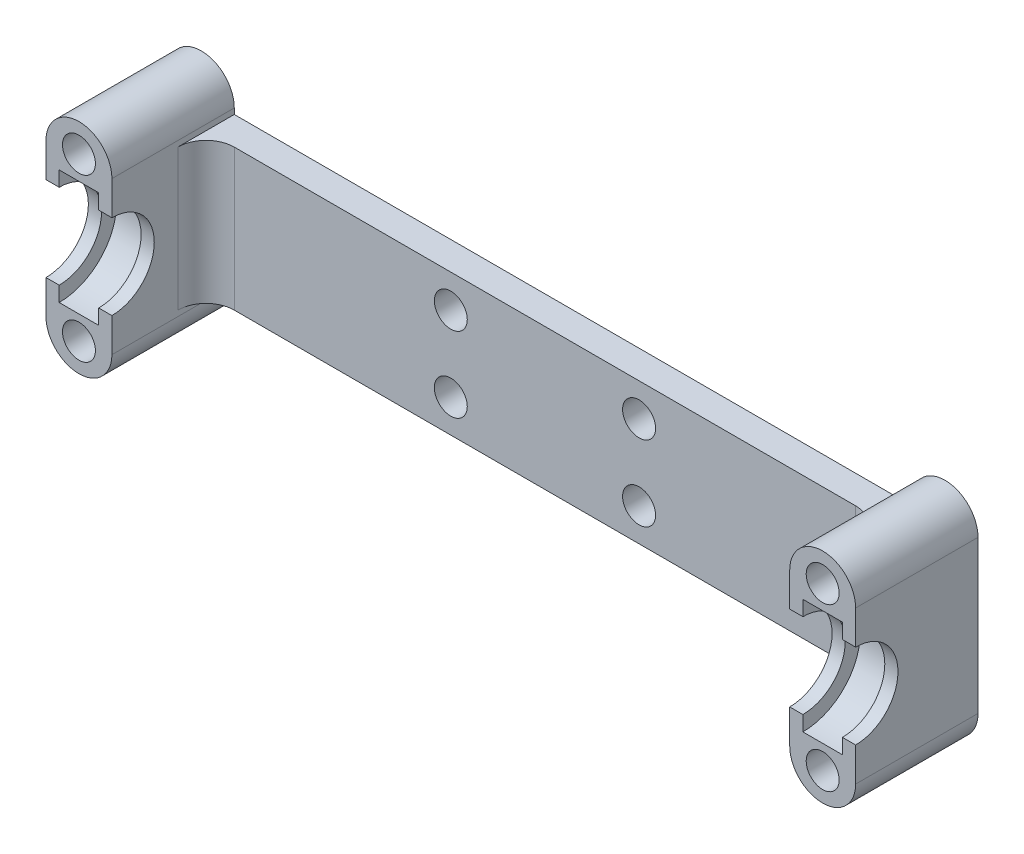
ISO-10303-21;
HEADER;
FILE_DESCRIPTION(('STEP AP214'),'2;1');
FILE_NAME('part.step','',(''),(''),'','','');
FILE_SCHEMA(('AUTOMOTIVE_DESIGN { 1 0 10303 214 1 1 1 1 }'));
ENDSEC;
DATA;
#1=APPLICATION_CONTEXT('core data for automotive mechanical design processes');
#2=APPLICATION_PROTOCOL_DEFINITION('international standard','automotive_design',2000,#1);
#3=PRODUCT_CONTEXT('',#1,'mechanical');
#4=PRODUCT('Part','Part','',(#3));
#5=PRODUCT_RELATED_PRODUCT_CATEGORY('part','',(#4));
#6=PRODUCT_DEFINITION_FORMATION('','',#4);
#7=PRODUCT_DEFINITION_CONTEXT('part definition',#1,'design');
#8=PRODUCT_DEFINITION('design','',#6,#7);
#9=PRODUCT_DEFINITION_SHAPE('','',#8);
#10=(LENGTH_UNIT() NAMED_UNIT(*) SI_UNIT(.MILLI.,.METRE.));
#11=(NAMED_UNIT(*) PLANE_ANGLE_UNIT() SI_UNIT($,.RADIAN.));
#12=(NAMED_UNIT(*) SI_UNIT($,.STERADIAN.) SOLID_ANGLE_UNIT());
#13=UNCERTAINTY_MEASURE_WITH_UNIT(LENGTH_MEASURE(1.E-05),#10,'distance_accuracy_value','');
#14=(GEOMETRIC_REPRESENTATION_CONTEXT(3) GLOBAL_UNCERTAINTY_ASSIGNED_CONTEXT((#13)) GLOBAL_UNIT_ASSIGNED_CONTEXT((#10,
#11,#12)) REPRESENTATION_CONTEXT('',''));
#15=CARTESIAN_POINT('',(0.,0.,0.));
#16=DIRECTION('',(0.,0.,1.));
#17=DIRECTION('',(1.,0.,0.));
#18=AXIS2_PLACEMENT_3D('',#15,#16,#17);
#19=CARTESIAN_POINT('',(-43.,-7.5,3.));
#20=DIRECTION('',(0.,1.,0.));
#21=DIRECTION('',(0.,0.,1.));
#22=AXIS2_PLACEMENT_3D('',#19,#20,#21);
#23=PLANE('',#22);
#24=DIRECTION('',(0.,0.,1.));
#25=VECTOR('',#24,1.);
#26=CARTESIAN_POINT('',(-36.,-7.5,3.));
#27=LINE('',#26,#25);
#28=CARTESIAN_POINT('',(-36.,-7.5,0.));
#29=VERTEX_POINT('',#28);
#30=CARTESIAN_POINT('',(-36.,-7.5,6.));
#31=VERTEX_POINT('',#30);
#32=EDGE_CURVE('E69',#29,#31,#27,.T.);
#33=ORIENTED_EDGE('',*,*,#32,.F.);
#34=DIRECTION('',(1.,0.,0.));
#35=VECTOR('',#34,1.);
#36=CARTESIAN_POINT('',(-43.,-7.5,0.));
#37=LINE('',#36,#35);
#38=CARTESIAN_POINT('',(36.,-7.5,0.));
#39=VERTEX_POINT('',#38);
#40=EDGE_CURVE('E437',#29,#39,#37,.T.);
#41=ORIENTED_EDGE('',*,*,#40,.T.);
#42=DIRECTION('',(0.,0.,1.));
#43=VECTOR('',#42,1.);
#44=CARTESIAN_POINT('',(36.,-7.5,3.));
#45=LINE('',#44,#43);
#46=CARTESIAN_POINT('',(36.,-7.5,6.));
#47=VERTEX_POINT('',#46);
#48=EDGE_CURVE('E305',#39,#47,#45,.T.);
#49=ORIENTED_EDGE('',*,*,#48,.T.);
#50=CARTESIAN_POINT('',(33.,-7.5,6.));
#51=DIRECTION('',(0.,1.,0.));
#52=DIRECTION('',(0.,0.,1.));
#53=AXIS2_PLACEMENT_3D('',#50,#51,#52);
#54=CIRCLE('',#53,3.);
#55=CARTESIAN_POINT('',(33.,-7.5,3.));
#56=VERTEX_POINT('',#55);
#57=EDGE_CURVE('E502',#47,#56,#54,.T.);
#58=ORIENTED_EDGE('',*,*,#57,.T.);
#59=DIRECTION('',(1.,0.,0.));
#60=VECTOR('',#59,1.);
#61=CARTESIAN_POINT('',(-43.,-7.5,3.));
#62=LINE('',#61,#60);
#63=CARTESIAN_POINT('',(-33.,-7.5,3.));
#64=VERTEX_POINT('',#63);
#65=EDGE_CURVE('E436',#64,#56,#62,.T.);
#66=ORIENTED_EDGE('',*,*,#65,.F.);
#67=CARTESIAN_POINT('',(-33.,-7.5,6.));
#68=DIRECTION('',(0.,1.,0.));
#69=DIRECTION('',(0.,0.,1.));
#70=AXIS2_PLACEMENT_3D('',#67,#68,#69);
#71=CIRCLE('',#70,3.);
#72=EDGE_CURVE('E11',#64,#31,#71,.T.);
#73=ORIENTED_EDGE('',*,*,#72,.T.);
#74=EDGE_LOOP('',(#33,#41,#49,#58,#66,#73));
#75=FACE_BOUND('',#74,.T.);
#76=ADVANCED_FACE('F45',(#75),#23,.F.);
#77=CARTESIAN_POINT('',(-43.,0.,13.));
#78=DIRECTION('',(1.,0.,0.));
#79=DIRECTION('',(0.,0.,-1.));
#80=AXIS2_PLACEMENT_3D('',#77,#78,#79);
#81=CYLINDRICAL_SURFACE('',#80,4.5);
#82=CARTESIAN_POINT('',(-37.4,0.,13.));
#83=DIRECTION('',(-1.,0.,0.));
#84=DIRECTION('',(0.,0.,1.));
#85=AXIS2_PLACEMENT_3D('',#82,#83,#84);
#86=CIRCLE('',#85,4.5);
#87=CARTESIAN_POINT('',(-37.4,-4.5,13.));
#88=VERTEX_POINT('',#87);
#89=CARTESIAN_POINT('',(-37.4,4.5,13.));
#90=VERTEX_POINT('',#89);
#91=EDGE_CURVE('E470',#88,#90,#86,.F.);
#92=ORIENTED_EDGE('',*,*,#91,.F.);
#93=DIRECTION('',(1.,0.,0.));
#94=VECTOR('',#93,1.);
#95=CARTESIAN_POINT('',(-43.,-4.5,13.));
#96=LINE('',#95,#94);
#97=CARTESIAN_POINT('',(-36.,-4.5,13.));
#98=VERTEX_POINT('',#97);
#99=EDGE_CURVE('E413',#88,#98,#96,.T.);
#100=ORIENTED_EDGE('',*,*,#99,.T.);
#101=CARTESIAN_POINT('',(-36.,0.,13.));
#102=DIRECTION('',(-1.,0.,0.));
#103=DIRECTION('',(0.,0.,1.));
#104=AXIS2_PLACEMENT_3D('',#101,#102,#103);
#105=CIRCLE('',#104,4.5);
#106=CARTESIAN_POINT('',(-36.,4.5,13.));
#107=VERTEX_POINT('',#106);
#108=EDGE_CURVE('E409',#107,#98,#105,.T.);
#109=ORIENTED_EDGE('',*,*,#108,.F.);
#110=DIRECTION('',(1.,0.,0.));
#111=VECTOR('',#110,1.);
#112=CARTESIAN_POINT('',(-43.,4.5,13.));
#113=LINE('',#112,#111);
#114=EDGE_CURVE('E405',#107,#90,#113,.F.);
#115=ORIENTED_EDGE('',*,*,#114,.T.);
#116=EDGE_LOOP('',(#92,#100,#109,#115));
#117=FACE_BOUND('',#116,.T.);
#118=ADVANCED_FACE('F568',(#117),#81,.F.);
#119=CARTESIAN_POINT('',(-43.,7.5,3.));
#120=DIRECTION('',(0.,-1.,0.));
#121=DIRECTION('',(0.,0.,-1.));
#122=AXIS2_PLACEMENT_3D('',#119,#120,#121);
#123=PLANE('',#122);
#124=DIRECTION('',(-1.,0.,0.));
#125=VECTOR('',#124,1.);
#126=CARTESIAN_POINT('',(-43.,7.5,0.));
#127=LINE('',#126,#125);
#128=CARTESIAN_POINT('',(36.,7.5,0.));
#129=VERTEX_POINT('',#128);
#130=CARTESIAN_POINT('',(-36.,7.5,0.));
#131=VERTEX_POINT('',#130);
#132=EDGE_CURVE('E444',#129,#131,#127,.T.);
#133=ORIENTED_EDGE('',*,*,#132,.T.);
#134=DIRECTION('',(0.,0.,1.));
#135=VECTOR('',#134,1.);
#136=CARTESIAN_POINT('',(-36.,7.5,3.));
#137=LINE('',#136,#135);
#138=CARTESIAN_POINT('',(-36.,7.5,6.));
#139=VERTEX_POINT('',#138);
#140=EDGE_CURVE('E61',#131,#139,#137,.T.);
#141=ORIENTED_EDGE('',*,*,#140,.T.);
#142=CARTESIAN_POINT('',(-33.,7.5,6.));
#143=DIRECTION('',(0.,-1.,0.));
#144=DIRECTION('',(0.,0.,-1.));
#145=AXIS2_PLACEMENT_3D('',#142,#143,#144);
#146=CIRCLE('',#145,3.);
#147=CARTESIAN_POINT('',(-33.,7.5,3.));
#148=VERTEX_POINT('',#147);
#149=EDGE_CURVE('E54',#139,#148,#146,.T.);
#150=ORIENTED_EDGE('',*,*,#149,.T.);
#151=DIRECTION('',(-1.,0.,0.));
#152=VECTOR('',#151,1.);
#153=CARTESIAN_POINT('',(-43.,7.5,3.));
#154=LINE('',#153,#152);
#155=CARTESIAN_POINT('',(33.,7.5,3.));
#156=VERTEX_POINT('',#155);
#157=EDGE_CURVE('E432',#156,#148,#154,.T.);
#158=ORIENTED_EDGE('',*,*,#157,.F.);
#159=CARTESIAN_POINT('',(33.,7.5,6.));
#160=DIRECTION('',(0.,-1.,0.));
#161=DIRECTION('',(0.,0.,-1.));
#162=AXIS2_PLACEMENT_3D('',#159,#160,#161);
#163=CIRCLE('',#162,3.);
#164=CARTESIAN_POINT('',(36.,7.5,6.));
#165=VERTEX_POINT('',#164);
#166=EDGE_CURVE('E505',#156,#165,#163,.T.);
#167=ORIENTED_EDGE('',*,*,#166,.T.);
#168=DIRECTION('',(0.,0.,1.));
#169=VECTOR('',#168,1.);
#170=CARTESIAN_POINT('',(36.,7.5,3.));
#171=LINE('',#170,#169);
#172=EDGE_CURVE('E366',#129,#165,#171,.T.);
#173=ORIENTED_EDGE('',*,*,#172,.F.);
#174=EDGE_LOOP('',(#133,#141,#150,#158,#167,#173));
#175=FACE_BOUND('',#174,.T.);
#176=ADVANCED_FACE('F510',(#175),#123,.F.);
#177=CARTESIAN_POINT('',(37.4,0.,13.));
#178=DIRECTION('',(1.,0.,0.));
#179=DIRECTION('',(0.,0.,-1.));
#180=AXIS2_PLACEMENT_3D('',#177,#178,#179);
#181=CIRCLE('',#180,4.5);
#182=CARTESIAN_POINT('',(37.4,4.5,13.));
#183=VERTEX_POINT('',#182);
#184=CARTESIAN_POINT('',(37.4,-4.5,13.));
#185=VERTEX_POINT('',#184);
#186=EDGE_CURVE('E460',#183,#185,#181,.F.);
#187=ORIENTED_EDGE('',*,*,#186,.F.);
#188=DIRECTION('',(1.,0.,0.));
#189=VECTOR('',#188,1.);
#190=CARTESIAN_POINT('',(-43.,4.5,13.));
#191=LINE('',#190,#189);
#192=CARTESIAN_POINT('',(36.,4.5,13.));
#193=VERTEX_POINT('',#192);
#194=EDGE_CURVE('E456',#193,#183,#191,.T.);
#195=ORIENTED_EDGE('',*,*,#194,.F.);
#196=CARTESIAN_POINT('',(36.,0.,13.));
#197=DIRECTION('',(1.,0.,0.));
#198=DIRECTION('',(0.,0.,-1.));
#199=AXIS2_PLACEMENT_3D('',#196,#197,#198);
#200=CIRCLE('',#199,4.5);
#201=CARTESIAN_POINT('',(36.,-4.5,13.));
#202=VERTEX_POINT('',#201);
#203=EDGE_CURVE('E397',#202,#193,#200,.T.);
#204=ORIENTED_EDGE('',*,*,#203,.F.);
#205=DIRECTION('',(1.,0.,0.));
#206=VECTOR('',#205,1.);
#207=CARTESIAN_POINT('',(-43.,-4.5,13.));
#208=LINE('',#207,#206);
#209=EDGE_CURVE('E441',#185,#202,#208,.F.);
#210=ORIENTED_EDGE('',*,*,#209,.F.);
#211=EDGE_LOOP('',(#187,#195,#204,#210));
#212=FACE_BOUND('',#211,.T.);
#213=ADVANCED_FACE('F612',(#212),#81,.F.);
#214=CARTESIAN_POINT('',(0.,0.,13.));
#215=DIRECTION('',(0.,0.,1.));
#216=DIRECTION('',(1.,0.,0.));
#217=AXIS2_PLACEMENT_3D('',#214,#215,#216);
#218=PLANE('',#217);
#219=CARTESIAN_POINT('',(-39.5,-8.60000000000001,13.));
#220=DIRECTION('',(0.,0.,1.));
#221=DIRECTION('',(1.,0.,0.));
#222=AXIS2_PLACEMENT_3D('',#219,#220,#221);
#223=CIRCLE('',#222,1.75);
#224=CARTESIAN_POINT('',(-37.75,-8.60000000000001,13.));
#225=VERTEX_POINT('',#224);
#226=EDGE_CURVE('E1103',#225,#225,#223,.T.);
#227=ORIENTED_EDGE('',*,*,#226,.F.);
#228=EDGE_LOOP('',(#227));
#229=FACE_BOUND('',#228,.T.);
#230=DIRECTION('',(0.,-1.,0.));
#231=VECTOR('',#230,1.);
#232=CARTESIAN_POINT('',(-41.6,0.,13.));
#233=LINE('',#232,#231);
#234=CARTESIAN_POINT('',(-41.6,-4.5,13.));
#235=VERTEX_POINT('',#234);
#236=CARTESIAN_POINT('',(-41.6,-6.1,13.));
#237=VERTEX_POINT('',#236);
#238=EDGE_CURVE('E325',#235,#237,#233,.T.);
#239=ORIENTED_EDGE('',*,*,#238,.F.);
#240=CARTESIAN_POINT('',(-43.,-4.5,13.));
#241=VERTEX_POINT('',#240);
#242=EDGE_CURVE('E230',#241,#235,#96,.T.);
#243=ORIENTED_EDGE('',*,*,#242,.F.);
#244=DIRECTION('',(0.,-1.,0.));
#245=VECTOR('',#244,1.);
#246=CARTESIAN_POINT('',(-43.,7.5,13.));
#247=LINE('',#246,#245);
#248=CARTESIAN_POINT('',(-43.,-8.1,13.));
#249=VERTEX_POINT('',#248);
#250=EDGE_CURVE('E221',#241,#249,#247,.T.);
#251=ORIENTED_EDGE('',*,*,#250,.T.);
#252=CARTESIAN_POINT('',(-39.5,-8.10000000000001,13.));
#253=DIRECTION('',(0.,0.,1.));
#254=DIRECTION('',(1.,0.,0.));
#255=AXIS2_PLACEMENT_3D('',#252,#253,#254);
#256=CIRCLE('',#255,3.5);
#257=CARTESIAN_POINT('',(-36.,-8.10000000000002,13.));
#258=VERTEX_POINT('',#257);
#259=EDGE_CURVE('E227',#249,#258,#256,.T.);
#260=ORIENTED_EDGE('',*,*,#259,.T.);
#261=DIRECTION('',(0.,1.,0.));
#262=VECTOR('',#261,1.);
#263=CARTESIAN_POINT('',(-36.,7.5,13.));
#264=LINE('',#263,#262);
#265=EDGE_CURVE('E428',#258,#98,#264,.T.);
#266=ORIENTED_EDGE('',*,*,#265,.T.);
#267=ORIENTED_EDGE('',*,*,#99,.F.);
#268=DIRECTION('',(0.,-1.,0.));
#269=VECTOR('',#268,1.);
#270=CARTESIAN_POINT('',(-37.4,0.,13.));
#271=LINE('',#270,#269);
#272=CARTESIAN_POINT('',(-37.4,-6.1,13.));
#273=VERTEX_POINT('',#272);
#274=EDGE_CURVE('E318',#88,#273,#271,.T.);
#275=ORIENTED_EDGE('',*,*,#274,.T.);
#276=DIRECTION('',(1.,0.,0.));
#277=VECTOR('',#276,1.);
#278=CARTESIAN_POINT('',(-41.6,-6.1,13.));
#279=LINE('',#278,#277);
#280=EDGE_CURVE('E328',#237,#273,#279,.T.);
#281=ORIENTED_EDGE('',*,*,#280,.F.);
#282=EDGE_LOOP('',(#239,#243,#251,#260,#266,#267,#275,#281));
#283=FACE_BOUND('',#282,.T.);
#284=ADVANCED_FACE('F224',(#229,#283),#218,.T.);
#285=CARTESIAN_POINT('',(0.,0.,13.));
#286=DIRECTION('',(0.,0.,-1.));
#287=DIRECTION('',(-1.,0.,0.));
#288=AXIS2_PLACEMENT_3D('',#285,#286,#287);
#289=PLANE('',#288);
#290=CARTESIAN_POINT('',(39.5,8.60000000000001,13.));
#291=DIRECTION('',(0.,0.,-1.));
#292=DIRECTION('',(-1.,0.,0.));
#293=AXIS2_PLACEMENT_3D('',#290,#291,#292);
#294=CIRCLE('',#293,1.75);
#295=CARTESIAN_POINT('',(37.75,8.60000000000001,13.));
#296=VERTEX_POINT('',#295);
#297=EDGE_CURVE('E343',#296,#296,#294,.T.);
#298=ORIENTED_EDGE('',*,*,#297,.T.);
#299=EDGE_LOOP('',(#298));
#300=FACE_BOUND('',#299,.T.);
#301=DIRECTION('',(-1.,0.,0.));
#302=VECTOR('',#301,1.);
#303=CARTESIAN_POINT('',(41.6,6.1,13.));
#304=LINE('',#303,#302);
#305=CARTESIAN_POINT('',(41.6,6.1,13.));
#306=VERTEX_POINT('',#305);
#307=CARTESIAN_POINT('',(37.4,6.1,13.));
#308=VERTEX_POINT('',#307);
#309=EDGE_CURVE('E389',#306,#308,#304,.T.);
#310=ORIENTED_EDGE('',*,*,#309,.F.);
#311=DIRECTION('',(0.,-1.,0.));
#312=VECTOR('',#311,1.);
#313=CARTESIAN_POINT('',(41.6,0.,13.));
#314=LINE('',#313,#312);
#315=CARTESIAN_POINT('',(41.6,4.5,13.));
#316=VERTEX_POINT('',#315);
#317=EDGE_CURVE('E385',#306,#316,#314,.T.);
#318=ORIENTED_EDGE('',*,*,#317,.T.);
#319=CARTESIAN_POINT('',(43.,4.5,13.));
#320=VERTEX_POINT('',#319);
#321=EDGE_CURVE('E455',#316,#320,#191,.T.);
#322=ORIENTED_EDGE('',*,*,#321,.T.);
#323=DIRECTION('',(0.,1.,0.));
#324=VECTOR('',#323,1.);
#325=CARTESIAN_POINT('',(43.,7.5,13.));
#326=LINE('',#325,#324);
#327=CARTESIAN_POINT('',(43.,8.1,13.));
#328=VERTEX_POINT('',#327);
#329=EDGE_CURVE('E421',#320,#328,#326,.T.);
#330=ORIENTED_EDGE('',*,*,#329,.T.);
#331=CARTESIAN_POINT('',(39.5,8.10000000000001,13.));
#332=DIRECTION('',(0.,0.,1.));
#333=DIRECTION('',(-1.,0.,0.));
#334=AXIS2_PLACEMENT_3D('',#331,#332,#333);
#335=CIRCLE('',#334,3.5);
#336=CARTESIAN_POINT('',(36.,8.10000000000002,13.));
#337=VERTEX_POINT('',#336);
#338=EDGE_CURVE('E348',#328,#337,#335,.T.);
#339=ORIENTED_EDGE('',*,*,#338,.T.);
#340=DIRECTION('',(0.,-1.,0.));
#341=VECTOR('',#340,1.);
#342=CARTESIAN_POINT('',(36.,7.5,13.));
#343=LINE('',#342,#341);
#344=EDGE_CURVE('E417',#337,#193,#343,.T.);
#345=ORIENTED_EDGE('',*,*,#344,.T.);
#346=ORIENTED_EDGE('',*,*,#194,.T.);
#347=DIRECTION('',(0.,-1.,0.));
#348=VECTOR('',#347,1.);
#349=CARTESIAN_POINT('',(37.4,0.,13.));
#350=LINE('',#349,#348);
#351=EDGE_CURVE('E378',#308,#183,#350,.T.);
#352=ORIENTED_EDGE('',*,*,#351,.F.);
#353=EDGE_LOOP('',(#310,#318,#322,#330,#339,#345,#346,#352));
#354=FACE_BOUND('',#353,.T.);
#355=ADVANCED_FACE('F588',(#300,#354),#289,.F.);
#356=CARTESIAN_POINT('',(0.,0.,3.));
#357=DIRECTION('',(0.,0.,1.));
#358=DIRECTION('',(1.,0.,0.));
#359=AXIS2_PLACEMENT_3D('',#356,#357,#358);
#360=PLANE('',#359);
#361=CARTESIAN_POINT('',(10.,4.,3.));
#362=DIRECTION('',(0.,0.,1.));
#363=DIRECTION('',(-1.,0.,0.));
#364=AXIS2_PLACEMENT_3D('',#361,#362,#363);
#365=CIRCLE('',#364,1.75);
#366=CARTESIAN_POINT('',(8.25,4.,3.));
#367=VERTEX_POINT('',#366);
#368=EDGE_CURVE('E1075',#367,#367,#365,.T.);
#369=ORIENTED_EDGE('',*,*,#368,.F.);
#370=EDGE_LOOP('',(#369));
#371=FACE_BOUND('',#370,.T.);
#372=CARTESIAN_POINT('',(10.,-4.,3.));
#373=DIRECTION('',(0.,0.,-1.));
#374=DIRECTION('',(-1.,0.,0.));
#375=AXIS2_PLACEMENT_3D('',#372,#373,#374);
#376=CIRCLE('',#375,1.75);
#377=CARTESIAN_POINT('',(8.25,-4.,3.));
#378=VERTEX_POINT('',#377);
#379=EDGE_CURVE('E1079',#378,#378,#376,.T.);
#380=ORIENTED_EDGE('',*,*,#379,.T.);
#381=EDGE_LOOP('',(#380));
#382=FACE_BOUND('',#381,.T.);
#383=CARTESIAN_POINT('',(-10.,4.,3.));
#384=DIRECTION('',(0.,0.,-1.));
#385=DIRECTION('',(1.,0.,0.));
#386=AXIS2_PLACEMENT_3D('',#383,#384,#385);
#387=CIRCLE('',#386,1.75);
#388=CARTESIAN_POINT('',(-8.25,4.,3.));
#389=VERTEX_POINT('',#388);
#390=EDGE_CURVE('E1083',#389,#389,#387,.T.);
#391=ORIENTED_EDGE('',*,*,#390,.T.);
#392=EDGE_LOOP('',(#391));
#393=FACE_BOUND('',#392,.T.);
#394=CARTESIAN_POINT('',(-10.,-4.,3.));
#395=DIRECTION('',(0.,0.,1.));
#396=DIRECTION('',(1.,0.,0.));
#397=AXIS2_PLACEMENT_3D('',#394,#395,#396);
#398=CIRCLE('',#397,1.75);
#399=CARTESIAN_POINT('',(-8.25,-4.,3.));
#400=VERTEX_POINT('',#399);
#401=EDGE_CURVE('E331',#400,#400,#398,.T.);
#402=ORIENTED_EDGE('',*,*,#401,.F.);
#403=EDGE_LOOP('',(#402));
#404=FACE_BOUND('',#403,.T.);
#405=ORIENTED_EDGE('',*,*,#65,.T.);
#406=DIRECTION('',(0.,-1.,0.));
#407=VECTOR('',#406,1.);
#408=CARTESIAN_POINT('',(33.,0.,3.));
#409=LINE('',#408,#407);
#410=EDGE_CURVE('E496',#56,#156,#409,.F.);
#411=ORIENTED_EDGE('',*,*,#410,.T.);
#412=ORIENTED_EDGE('',*,*,#157,.T.);
#413=DIRECTION('',(0.,1.,0.));
#414=VECTOR('',#413,1.);
#415=CARTESIAN_POINT('',(-33.,0.,3.));
#416=LINE('',#415,#414);
#417=EDGE_CURVE('E493',#148,#64,#416,.F.);
#418=ORIENTED_EDGE('',*,*,#417,.T.);
#419=EDGE_LOOP('',(#405,#411,#412,#418));
#420=FACE_BOUND('',#419,.T.);
#421=ADVANCED_FACE('F516',(#371,#382,#393,#404,#420),#360,.T.);
#422=CARTESIAN_POINT('',(43.,7.5,3.));
#423=DIRECTION('',(-1.,0.,0.));
#424=DIRECTION('',(0.,0.,1.));
#425=AXIS2_PLACEMENT_3D('',#422,#423,#424);
#426=PLANE('',#425);
#427=CARTESIAN_POINT('',(43.,0.,13.));
#428=DIRECTION('',(1.,0.,0.));
#429=DIRECTION('',(0.,0.,-1.));
#430=AXIS2_PLACEMENT_3D('',#427,#428,#429);
#431=CIRCLE('',#430,4.5);
#432=CARTESIAN_POINT('',(43.,-4.5,13.));
#433=VERTEX_POINT('',#432);
#434=EDGE_CURVE('E393',#433,#320,#431,.T.);
#435=ORIENTED_EDGE('',*,*,#434,.F.);
#436=CARTESIAN_POINT('',(43.,-8.1,13.));
#437=VERTEX_POINT('',#436);
#438=EDGE_CURVE('E235',#437,#433,#326,.T.);
#439=ORIENTED_EDGE('',*,*,#438,.F.);
#440=DIRECTION('',(0.,0.,-1.));
#441=VECTOR('',#440,1.);
#442=CARTESIAN_POINT('',(43.,-8.1,13.));
#443=LINE('',#442,#441);
#444=CARTESIAN_POINT('',(43.,-8.1,0.));
#445=VERTEX_POINT('',#444);
#446=EDGE_CURVE('E291',#437,#445,#443,.T.);
#447=ORIENTED_EDGE('',*,*,#446,.T.);
#448=DIRECTION('',(0.,1.,0.));
#449=VECTOR('',#448,1.);
#450=CARTESIAN_POINT('',(43.,7.5,0.));
#451=LINE('',#450,#449);
#452=CARTESIAN_POINT('',(43.,8.1,0.));
#453=VERTEX_POINT('',#452);
#454=EDGE_CURVE('E431',#445,#453,#451,.T.);
#455=ORIENTED_EDGE('',*,*,#454,.T.);
#456=DIRECTION('',(0.,0.,-1.));
#457=VECTOR('',#456,1.);
#458=CARTESIAN_POINT('',(43.,8.1,13.));
#459=LINE('',#458,#457);
#460=EDGE_CURVE('E362',#328,#453,#459,.T.);
#461=ORIENTED_EDGE('',*,*,#460,.F.);
#462=ORIENTED_EDGE('',*,*,#329,.F.);
#463=EDGE_LOOP('',(#435,#439,#447,#455,#461,#462));
#464=FACE_BOUND('',#463,.T.);
#465=ADVANCED_FACE('F597',(#464),#426,.F.);
#466=CARTESIAN_POINT('',(-43.,7.5,3.));
#467=DIRECTION('',(1.,0.,0.));
#468=DIRECTION('',(0.,0.,-1.));
#469=AXIS2_PLACEMENT_3D('',#466,#467,#468);
#470=PLANE('',#469);
#471=ORIENTED_EDGE('',*,*,#250,.F.);
#472=CARTESIAN_POINT('',(-43.,0.,13.));
#473=DIRECTION('',(1.,0.,0.));
#474=DIRECTION('',(0.,0.,-1.));
#475=AXIS2_PLACEMENT_3D('',#472,#473,#474);
#476=CIRCLE('',#475,4.5);
#477=CARTESIAN_POINT('',(-43.,4.5,13.));
#478=VERTEX_POINT('',#477);
#479=EDGE_CURVE('E394',#241,#478,#476,.T.);
#480=ORIENTED_EDGE('',*,*,#479,.T.);
#481=CARTESIAN_POINT('',(-43.,8.1,13.));
#482=VERTEX_POINT('',#481);
#483=EDGE_CURVE('E234',#482,#478,#247,.T.);
#484=ORIENTED_EDGE('',*,*,#483,.F.);
#485=DIRECTION('',(0.,0.,-1.));
#486=VECTOR('',#485,1.);
#487=CARTESIAN_POINT('',(-43.,8.1,13.));
#488=LINE('',#487,#486);
#489=CARTESIAN_POINT('',(-43.,8.1,0.));
#490=VERTEX_POINT('',#489);
#491=EDGE_CURVE('E271',#482,#490,#488,.T.);
#492=ORIENTED_EDGE('',*,*,#491,.T.);
#493=DIRECTION('',(0.,-1.,0.));
#494=VECTOR('',#493,1.);
#495=CARTESIAN_POINT('',(-43.,7.5,0.));
#496=LINE('',#495,#494);
#497=CARTESIAN_POINT('',(-43.,-8.1,0.));
#498=VERTEX_POINT('',#497);
#499=EDGE_CURVE('E241',#490,#498,#496,.T.);
#500=ORIENTED_EDGE('',*,*,#499,.T.);
#501=DIRECTION('',(0.,0.,-1.));
#502=VECTOR('',#501,1.);
#503=CARTESIAN_POINT('',(-43.,-8.1,13.));
#504=LINE('',#503,#502);
#505=EDGE_CURVE('E238',#249,#498,#504,.T.);
#506=ORIENTED_EDGE('',*,*,#505,.F.);
#507=EDGE_LOOP('',(#471,#480,#484,#492,#500,#506));
#508=FACE_BOUND('',#507,.T.);
#509=ADVANCED_FACE('F239',(#508),#470,.F.);
#510=CARTESIAN_POINT('',(0.,0.,0.));
#511=DIRECTION('',(0.,0.,1.));
#512=DIRECTION('',(1.,0.,0.));
#513=AXIS2_PLACEMENT_3D('',#510,#511,#512);
#514=PLANE('',#513);
#515=CARTESIAN_POINT('',(10.,4.,0.));
#516=DIRECTION('',(0.,0.,1.));
#517=DIRECTION('',(-1.,0.,0.));
#518=AXIS2_PLACEMENT_3D('',#515,#516,#517);
#519=CIRCLE('',#518,1.75);
#520=CARTESIAN_POINT('',(8.25,4.,0.));
#521=VERTEX_POINT('',#520);
#522=EDGE_CURVE('E1122',#521,#521,#519,.T.);
#523=ORIENTED_EDGE('',*,*,#522,.T.);
#524=EDGE_LOOP('',(#523));
#525=FACE_BOUND('',#524,.T.);
#526=CARTESIAN_POINT('',(10.,-4.,0.));
#527=DIRECTION('',(0.,0.,-1.));
#528=DIRECTION('',(-1.,0.,0.));
#529=AXIS2_PLACEMENT_3D('',#526,#527,#528);
#530=CIRCLE('',#529,1.75);
#531=CARTESIAN_POINT('',(8.25,-4.,0.));
#532=VERTEX_POINT('',#531);
#533=EDGE_CURVE('E1089',#532,#532,#530,.T.);
#534=ORIENTED_EDGE('',*,*,#533,.F.);
#535=EDGE_LOOP('',(#534));
#536=FACE_BOUND('',#535,.T.);
#537=CARTESIAN_POINT('',(-10.,4.,0.));
#538=DIRECTION('',(0.,0.,-1.));
#539=DIRECTION('',(1.,0.,0.));
#540=AXIS2_PLACEMENT_3D('',#537,#538,#539);
#541=CIRCLE('',#540,1.75);
#542=CARTESIAN_POINT('',(-8.25,4.,0.));
#543=VERTEX_POINT('',#542);
#544=EDGE_CURVE('E1088',#543,#543,#541,.T.);
#545=ORIENTED_EDGE('',*,*,#544,.F.);
#546=EDGE_LOOP('',(#545));
#547=FACE_BOUND('',#546,.T.);
#548=CARTESIAN_POINT('',(-39.5,-8.60000000000001,0.));
#549=DIRECTION('',(0.,0.,1.));
#550=DIRECTION('',(-1.,0.,0.));
#551=AXIS2_PLACEMENT_3D('',#548,#549,#550);
#552=CIRCLE('',#551,1.75);
#553=CARTESIAN_POINT('',(-41.25,-8.60000000000001,0.));
#554=VERTEX_POINT('',#553);
#555=EDGE_CURVE('E1094',#554,#554,#552,.T.);
#556=ORIENTED_EDGE('',*,*,#555,.T.);
#557=EDGE_LOOP('',(#556));
#558=FACE_BOUND('',#557,.T.);
#559=CARTESIAN_POINT('',(-39.5,8.60000000000001,0.));
#560=DIRECTION('',(0.,0.,-1.));
#561=DIRECTION('',(-1.,0.,0.));
#562=AXIS2_PLACEMENT_3D('',#559,#560,#561);
#563=CIRCLE('',#562,1.75);
#564=CARTESIAN_POINT('',(-41.25,8.60000000000001,0.));
#565=VERTEX_POINT('',#564);
#566=EDGE_CURVE('E489',#565,#565,#563,.T.);
#567=ORIENTED_EDGE('',*,*,#566,.F.);
#568=EDGE_LOOP('',(#567));
#569=FACE_BOUND('',#568,.T.);
#570=CARTESIAN_POINT('',(39.5,-8.60000000000001,0.));
#571=DIRECTION('',(0.,0.,-1.));
#572=DIRECTION('',(1.,0.,0.));
#573=AXIS2_PLACEMENT_3D('',#570,#571,#572);
#574=CIRCLE('',#573,1.75);
#575=CARTESIAN_POINT('',(41.25,-8.60000000000001,0.));
#576=VERTEX_POINT('',#575);
#577=EDGE_CURVE('E259',#576,#576,#574,.T.);
#578=ORIENTED_EDGE('',*,*,#577,.F.);
#579=EDGE_LOOP('',(#578));
#580=FACE_BOUND('',#579,.T.);
#581=ORIENTED_EDGE('',*,*,#40,.F.);
#582=DIRECTION('',(0.,1.,0.));
#583=VECTOR('',#582,1.);
#584=CARTESIAN_POINT('',(-36.,-8.10000000000002,0.));
#585=LINE('',#584,#583);
#586=CARTESIAN_POINT('',(-36.,-8.10000000000002,0.));
#587=VERTEX_POINT('',#586);
#588=EDGE_CURVE('E250',#587,#29,#585,.T.);
#589=ORIENTED_EDGE('',*,*,#588,.F.);
#590=CARTESIAN_POINT('',(-39.5,-8.10000000000001,0.));
#591=DIRECTION('',(0.,0.,1.));
#592=DIRECTION('',(1.,0.,0.));
#593=AXIS2_PLACEMENT_3D('',#590,#591,#592);
#594=CIRCLE('',#593,3.5);
#595=EDGE_CURVE('E255',#498,#587,#594,.T.);
#596=ORIENTED_EDGE('',*,*,#595,.F.);
#597=ORIENTED_EDGE('',*,*,#499,.F.);
#598=CARTESIAN_POINT('',(-39.5,8.10000000000001,0.));
#599=DIRECTION('',(0.,0.,-1.));
#600=DIRECTION('',(1.,0.,0.));
#601=AXIS2_PLACEMENT_3D('',#598,#599,#600);
#602=CIRCLE('',#601,3.5);
#603=CARTESIAN_POINT('',(-36.,8.10000000000002,0.));
#604=VERTEX_POINT('',#603);
#605=EDGE_CURVE('E272',#490,#604,#602,.T.);
#606=ORIENTED_EDGE('',*,*,#605,.T.);
#607=DIRECTION('',(0.,-1.,0.));
#608=VECTOR('',#607,1.);
#609=CARTESIAN_POINT('',(-36.,8.10000000000002,0.));
#610=LINE('',#609,#608);
#611=EDGE_CURVE('E266',#604,#131,#610,.T.);
#612=ORIENTED_EDGE('',*,*,#611,.T.);
#613=ORIENTED_EDGE('',*,*,#132,.F.);
#614=DIRECTION('',(0.,-1.,0.));
#615=VECTOR('',#614,1.);
#616=CARTESIAN_POINT('',(36.,8.10000000000002,0.));
#617=LINE('',#616,#615);
#618=CARTESIAN_POINT('',(36.,8.10000000000002,0.));
#619=VERTEX_POINT('',#618);
#620=EDGE_CURVE('E353',#619,#129,#617,.T.);
#621=ORIENTED_EDGE('',*,*,#620,.F.);
#622=CARTESIAN_POINT('',(39.5,8.10000000000001,0.));
#623=DIRECTION('',(0.,0.,1.));
#624=DIRECTION('',(-1.,0.,0.));
#625=AXIS2_PLACEMENT_3D('',#622,#623,#624);
#626=CIRCLE('',#625,3.5);
#627=EDGE_CURVE('E347',#453,#619,#626,.T.);
#628=ORIENTED_EDGE('',*,*,#627,.F.);
#629=ORIENTED_EDGE('',*,*,#454,.F.);
#630=CARTESIAN_POINT('',(39.5,-8.10000000000001,0.));
#631=DIRECTION('',(0.,0.,-1.));
#632=DIRECTION('',(-1.,0.,0.));
#633=AXIS2_PLACEMENT_3D('',#630,#631,#632);
#634=CIRCLE('',#633,3.5);
#635=CARTESIAN_POINT('',(36.,-8.10000000000002,0.));
#636=VERTEX_POINT('',#635);
#637=EDGE_CURVE('E292',#445,#636,#634,.T.);
#638=ORIENTED_EDGE('',*,*,#637,.T.);
#639=DIRECTION('',(0.,1.,0.));
#640=VECTOR('',#639,1.);
#641=CARTESIAN_POINT('',(36.,-8.10000000000002,0.));
#642=LINE('',#641,#640);
#643=EDGE_CURVE('E286',#636,#39,#642,.T.);
#644=ORIENTED_EDGE('',*,*,#643,.T.);
#645=EDGE_LOOP('',(#581,#589,#596,#597,#606,#612,#613,#621,#628,#629,#638,#644));
#646=FACE_BOUND('',#645,.T.);
#647=CARTESIAN_POINT('',(39.5,8.60000000000001,0.));
#648=DIRECTION('',(0.,0.,1.));
#649=DIRECTION('',(1.,0.,0.));
#650=AXIS2_PLACEMENT_3D('',#647,#648,#649);
#651=CIRCLE('',#650,1.75);
#652=CARTESIAN_POINT('',(41.25,8.60000000000001,0.));
#653=VERTEX_POINT('',#652);
#654=EDGE_CURVE('E336',#653,#653,#651,.T.);
#655=ORIENTED_EDGE('',*,*,#654,.T.);
#656=EDGE_LOOP('',(#655));
#657=FACE_BOUND('',#656,.T.);
#658=CARTESIAN_POINT('',(-10.,-4.,0.));
#659=DIRECTION('',(0.,0.,1.));
#660=DIRECTION('',(1.,0.,0.));
#661=AXIS2_PLACEMENT_3D('',#658,#659,#660);
#662=CIRCLE('',#661,1.75);
#663=CARTESIAN_POINT('',(-8.25,-4.,0.));
#664=VERTEX_POINT('',#663);
#665=EDGE_CURVE('E332',#664,#664,#662,.T.);
#666=ORIENTED_EDGE('',*,*,#665,.T.);
#667=EDGE_LOOP('',(#666));
#668=FACE_BOUND('',#667,.T.);
#669=ADVANCED_FACE('F532',(#525,#536,#547,#558,#569,#580,#646,#657,#668),#514,.F.);
#670=CARTESIAN_POINT('',(-36.,7.5,13.));
#671=DIRECTION('',(-1.,0.,0.));
#672=DIRECTION('',(0.,0.,1.));
#673=AXIS2_PLACEMENT_3D('',#670,#671,#672);
#674=PLANE('',#673);
#675=DIRECTION('',(0.,1.,0.));
#676=VECTOR('',#675,1.);
#677=CARTESIAN_POINT('',(-36.,7.5,6.));
#678=LINE('',#677,#676);
#679=EDGE_CURVE('E499',#31,#139,#678,.T.);
#680=ORIENTED_EDGE('',*,*,#679,.T.);
#681=ORIENTED_EDGE('',*,*,#140,.F.);
#682=ORIENTED_EDGE('',*,*,#611,.F.);
#683=DIRECTION('',(0.,0.,-1.));
#684=VECTOR('',#683,1.);
#685=CARTESIAN_POINT('',(-36.,8.10000000000002,13.));
#686=LINE('',#685,#684);
#687=CARTESIAN_POINT('',(-36.,8.10000000000002,13.));
#688=VERTEX_POINT('',#687);
#689=EDGE_CURVE('E281',#688,#604,#686,.T.);
#690=ORIENTED_EDGE('',*,*,#689,.F.);
#691=EDGE_CURVE('E427',#107,#688,#264,.T.);
#692=ORIENTED_EDGE('',*,*,#691,.F.);
#693=ORIENTED_EDGE('',*,*,#108,.T.);
#694=ORIENTED_EDGE('',*,*,#265,.F.);
#695=DIRECTION('',(0.,0.,-1.));
#696=VECTOR('',#695,1.);
#697=CARTESIAN_POINT('',(-36.,-8.10000000000002,13.));
#698=LINE('',#697,#696);
#699=EDGE_CURVE('E245',#258,#587,#698,.T.);
#700=ORIENTED_EDGE('',*,*,#699,.T.);
#701=ORIENTED_EDGE('',*,*,#588,.T.);
#702=ORIENTED_EDGE('',*,*,#32,.T.);
#703=EDGE_LOOP('',(#680,#681,#682,#690,#692,#693,#694,#700,#701,#702));
#704=FACE_BOUND('',#703,.T.);
#705=ADVANCED_FACE('F537',(#704),#674,.F.);
#706=CARTESIAN_POINT('',(-39.5,8.60000000000001,13.));
#707=DIRECTION('',(0.,0.,1.));
#708=DIRECTION('',(1.,0.,0.));
#709=AXIS2_PLACEMENT_3D('',#706,#707,#708);
#710=CIRCLE('',#709,1.75);
#711=CARTESIAN_POINT('',(-37.75,8.60000000000001,13.));
#712=VERTEX_POINT('',#711);
#713=EDGE_CURVE('E485',#712,#712,#710,.F.);
#714=ORIENTED_EDGE('',*,*,#713,.T.);
#715=EDGE_LOOP('',(#714));
#716=FACE_BOUND('',#715,.T.);
#717=DIRECTION('',(0.,-1.,0.));
#718=VECTOR('',#717,1.);
#719=CARTESIAN_POINT('',(-41.6,0.,13.));
#720=LINE('',#719,#718);
#721=CARTESIAN_POINT('',(-41.6,6.1,13.));
#722=VERTEX_POINT('',#721);
#723=CARTESIAN_POINT('',(-41.6,4.5,13.));
#724=VERTEX_POINT('',#723);
#725=EDGE_CURVE('E322',#722,#724,#720,.T.);
#726=ORIENTED_EDGE('',*,*,#725,.F.);
#727=DIRECTION('',(1.,0.,0.));
#728=VECTOR('',#727,1.);
#729=CARTESIAN_POINT('',(-41.6,6.1,13.));
#730=LINE('',#729,#728);
#731=CARTESIAN_POINT('',(-37.4,6.1,13.));
#732=VERTEX_POINT('',#731);
#733=EDGE_CURVE('E477',#732,#722,#730,.F.);
#734=ORIENTED_EDGE('',*,*,#733,.F.);
#735=DIRECTION('',(0.,-1.,0.));
#736=VECTOR('',#735,1.);
#737=CARTESIAN_POINT('',(-37.4,0.,13.));
#738=LINE('',#737,#736);
#739=EDGE_CURVE('E314',#732,#90,#738,.T.);
#740=ORIENTED_EDGE('',*,*,#739,.T.);
#741=ORIENTED_EDGE('',*,*,#114,.F.);
#742=ORIENTED_EDGE('',*,*,#691,.T.);
#743=CARTESIAN_POINT('',(-39.5,8.10000000000001,13.));
#744=DIRECTION('',(0.,0.,-1.));
#745=DIRECTION('',(1.,0.,0.));
#746=AXIS2_PLACEMENT_3D('',#743,#744,#745);
#747=CIRCLE('',#746,3.5);
#748=EDGE_CURVE('E267',#482,#688,#747,.T.);
#749=ORIENTED_EDGE('',*,*,#748,.F.);
#750=ORIENTED_EDGE('',*,*,#483,.T.);
#751=EDGE_CURVE('E404',#724,#478,#113,.F.);
#752=ORIENTED_EDGE('',*,*,#751,.F.);
#753=EDGE_LOOP('',(#726,#734,#740,#741,#742,#749,#750,#752));
#754=FACE_BOUND('',#753,.T.);
#755=ADVANCED_FACE('F545',(#716,#754),#218,.T.);
#756=CARTESIAN_POINT('',(36.,7.5,13.));
#757=DIRECTION('',(1.,0.,0.));
#758=DIRECTION('',(0.,0.,-1.));
#759=AXIS2_PLACEMENT_3D('',#756,#757,#758);
#760=PLANE('',#759);
#761=DIRECTION('',(0.,-1.,0.));
#762=VECTOR('',#761,1.);
#763=CARTESIAN_POINT('',(36.,7.5,6.));
#764=LINE('',#763,#762);
#765=EDGE_CURVE('E481',#165,#47,#764,.T.);
#766=ORIENTED_EDGE('',*,*,#765,.T.);
#767=ORIENTED_EDGE('',*,*,#48,.F.);
#768=ORIENTED_EDGE('',*,*,#643,.F.);
#769=DIRECTION('',(0.,0.,-1.));
#770=VECTOR('',#769,1.);
#771=CARTESIAN_POINT('',(36.,-8.10000000000002,13.));
#772=LINE('',#771,#770);
#773=CARTESIAN_POINT('',(36.,-8.10000000000002,13.));
#774=VERTEX_POINT('',#773);
#775=EDGE_CURVE('E302',#774,#636,#772,.T.);
#776=ORIENTED_EDGE('',*,*,#775,.F.);
#777=EDGE_CURVE('E416',#202,#774,#343,.T.);
#778=ORIENTED_EDGE('',*,*,#777,.F.);
#779=ORIENTED_EDGE('',*,*,#203,.T.);
#780=ORIENTED_EDGE('',*,*,#344,.F.);
#781=DIRECTION('',(0.,0.,-1.));
#782=VECTOR('',#781,1.);
#783=CARTESIAN_POINT('',(36.,8.10000000000002,13.));
#784=LINE('',#783,#782);
#785=EDGE_CURVE('E352',#337,#619,#784,.T.);
#786=ORIENTED_EDGE('',*,*,#785,.T.);
#787=ORIENTED_EDGE('',*,*,#620,.T.);
#788=ORIENTED_EDGE('',*,*,#172,.T.);
#789=EDGE_LOOP('',(#766,#767,#768,#776,#778,#779,#780,#786,#787,#788));
#790=FACE_BOUND('',#789,.T.);
#791=ADVANCED_FACE('F528',(#790),#760,.F.);
#792=CARTESIAN_POINT('',(39.5,-8.60000000000001,13.));
#793=DIRECTION('',(0.,0.,-1.));
#794=DIRECTION('',(-1.,0.,0.));
#795=AXIS2_PLACEMENT_3D('',#792,#793,#794);
#796=CIRCLE('',#795,1.75);
#797=CARTESIAN_POINT('',(37.75,-8.60000000000001,13.));
#798=VERTEX_POINT('',#797);
#799=EDGE_CURVE('E262',#798,#798,#796,.F.);
#800=ORIENTED_EDGE('',*,*,#799,.F.);
#801=EDGE_LOOP('',(#800));
#802=FACE_BOUND('',#801,.T.);
#803=CARTESIAN_POINT('',(41.6,-4.5,13.));
#804=VERTEX_POINT('',#803);
#805=EDGE_CURVE('E451',#433,#804,#208,.F.);
#806=ORIENTED_EDGE('',*,*,#805,.T.);
#807=DIRECTION('',(0.,-1.,0.));
#808=VECTOR('',#807,1.);
#809=CARTESIAN_POINT('',(41.6,0.,13.));
#810=LINE('',#809,#808);
#811=CARTESIAN_POINT('',(41.6,-6.1,13.));
#812=VERTEX_POINT('',#811);
#813=EDGE_CURVE('E381',#804,#812,#810,.T.);
#814=ORIENTED_EDGE('',*,*,#813,.T.);
#815=DIRECTION('',(-1.,0.,0.));
#816=VECTOR('',#815,1.);
#817=CARTESIAN_POINT('',(41.6,-6.1,13.));
#818=LINE('',#817,#816);
#819=CARTESIAN_POINT('',(37.4,-6.1,13.));
#820=VERTEX_POINT('',#819);
#821=EDGE_CURVE('E467',#820,#812,#818,.F.);
#822=ORIENTED_EDGE('',*,*,#821,.F.);
#823=DIRECTION('',(0.,-1.,0.));
#824=VECTOR('',#823,1.);
#825=CARTESIAN_POINT('',(37.4,0.,13.));
#826=LINE('',#825,#824);
#827=EDGE_CURVE('E375',#185,#820,#826,.T.);
#828=ORIENTED_EDGE('',*,*,#827,.F.);
#829=ORIENTED_EDGE('',*,*,#209,.T.);
#830=ORIENTED_EDGE('',*,*,#777,.T.);
#831=CARTESIAN_POINT('',(39.5,-8.10000000000001,13.));
#832=DIRECTION('',(0.,0.,-1.));
#833=DIRECTION('',(-1.,0.,0.));
#834=AXIS2_PLACEMENT_3D('',#831,#832,#833);
#835=CIRCLE('',#834,3.5);
#836=EDGE_CURVE('E287',#437,#774,#835,.T.);
#837=ORIENTED_EDGE('',*,*,#836,.F.);
#838=ORIENTED_EDGE('',*,*,#438,.T.);
#839=EDGE_LOOP('',(#806,#814,#822,#828,#829,#830,#837,#838));
#840=FACE_BOUND('',#839,.T.);
#841=ADVANCED_FACE('F581',(#802,#840),#289,.F.);
#842=ORIENTED_EDGE('',*,*,#321,.F.);
#843=CARTESIAN_POINT('',(41.6,0.,13.));
#844=DIRECTION('',(1.,0.,0.));
#845=DIRECTION('',(0.,0.,-1.));
#846=AXIS2_PLACEMENT_3D('',#843,#844,#845);
#847=CIRCLE('',#846,4.5);
#848=EDGE_CURVE('E463',#316,#804,#847,.F.);
#849=ORIENTED_EDGE('',*,*,#848,.T.);
#850=ORIENTED_EDGE('',*,*,#805,.F.);
#851=ORIENTED_EDGE('',*,*,#434,.T.);
#852=EDGE_LOOP('',(#842,#849,#850,#851));
#853=FACE_BOUND('',#852,.T.);
#854=ADVANCED_FACE('F600',(#853),#81,.F.);
#855=ORIENTED_EDGE('',*,*,#242,.T.);
#856=CARTESIAN_POINT('',(-41.6,0.,13.));
#857=DIRECTION('',(-1.,0.,0.));
#858=DIRECTION('',(0.,0.,1.));
#859=AXIS2_PLACEMENT_3D('',#856,#857,#858);
#860=CIRCLE('',#859,4.5);
#861=EDGE_CURVE('E473',#235,#724,#860,.F.);
#862=ORIENTED_EDGE('',*,*,#861,.T.);
#863=ORIENTED_EDGE('',*,*,#751,.T.);
#864=ORIENTED_EDGE('',*,*,#479,.F.);
#865=EDGE_LOOP('',(#855,#862,#863,#864));
#866=FACE_BOUND('',#865,.T.);
#867=ADVANCED_FACE('F554',(#866),#81,.F.);
#868=CARTESIAN_POINT('',(41.6,0.,13.));
#869=DIRECTION('',(-1.,0.,0.));
#870=DIRECTION('',(0.,0.,1.));
#871=AXIS2_PLACEMENT_3D('',#868,#869,#870);
#872=CYLINDRICAL_SURFACE('',#871,6.1);
#873=ORIENTED_EDGE('',*,*,#309,.T.);
#874=CARTESIAN_POINT('',(37.4,0.,13.));
#875=DIRECTION('',(1.,0.,0.));
#876=DIRECTION('',(0.,0.,-1.));
#877=AXIS2_PLACEMENT_3D('',#874,#875,#876);
#878=CIRCLE('',#877,6.1);
#879=EDGE_CURVE('E369',#820,#308,#878,.T.);
#880=ORIENTED_EDGE('',*,*,#879,.F.);
#881=ORIENTED_EDGE('',*,*,#821,.T.);
#882=CARTESIAN_POINT('',(41.6,0.,13.));
#883=DIRECTION('',(1.,0.,0.));
#884=DIRECTION('',(0.,0.,-1.));
#885=AXIS2_PLACEMENT_3D('',#882,#883,#884);
#886=CIRCLE('',#885,6.1);
#887=EDGE_CURVE('E372',#812,#306,#886,.T.);
#888=ORIENTED_EDGE('',*,*,#887,.T.);
#889=EDGE_LOOP('',(#873,#880,#881,#888));
#890=FACE_BOUND('',#889,.T.);
#891=ADVANCED_FACE('F607',(#890),#872,.F.);
#892=CARTESIAN_POINT('',(41.6,0.,13.));
#893=DIRECTION('',(1.,0.,0.));
#894=DIRECTION('',(0.,0.,-1.));
#895=AXIS2_PLACEMENT_3D('',#892,#893,#894);
#896=PLANE('',#895);
#897=ORIENTED_EDGE('',*,*,#317,.F.);
#898=ORIENTED_EDGE('',*,*,#887,.F.);
#899=ORIENTED_EDGE('',*,*,#813,.F.);
#900=ORIENTED_EDGE('',*,*,#848,.F.);
#901=EDGE_LOOP('',(#897,#898,#899,#900));
#902=FACE_BOUND('',#901,.T.);
#903=ADVANCED_FACE('F605',(#902),#896,.F.);
#904=CARTESIAN_POINT('',(37.4,0.,13.));
#905=DIRECTION('',(1.,0.,0.));
#906=DIRECTION('',(0.,0.,-1.));
#907=AXIS2_PLACEMENT_3D('',#904,#905,#906);
#908=PLANE('',#907);
#909=ORIENTED_EDGE('',*,*,#186,.T.);
#910=ORIENTED_EDGE('',*,*,#827,.T.);
#911=ORIENTED_EDGE('',*,*,#879,.T.);
#912=ORIENTED_EDGE('',*,*,#351,.T.);
#913=EDGE_LOOP('',(#909,#910,#911,#912));
#914=FACE_BOUND('',#913,.T.);
#915=ADVANCED_FACE('F610',(#914),#908,.T.);
#916=CARTESIAN_POINT('',(39.5,8.10000000000001,13.));
#917=DIRECTION('',(0.,0.,-1.));
#918=DIRECTION('',(-1.,0.,0.));
#919=AXIS2_PLACEMENT_3D('',#916,#917,#918);
#920=CYLINDRICAL_SURFACE('',#919,3.5);
#921=ORIENTED_EDGE('',*,*,#627,.T.);
#922=ORIENTED_EDGE('',*,*,#785,.F.);
#923=ORIENTED_EDGE('',*,*,#338,.F.);
#924=ORIENTED_EDGE('',*,*,#460,.T.);
#925=EDGE_LOOP('',(#921,#922,#923,#924));
#926=FACE_BOUND('',#925,.T.);
#927=ADVANCED_FACE('F594',(#926),#920,.T.);
#928=CARTESIAN_POINT('',(39.5,8.60000000000001,0.));
#929=DIRECTION('',(0.,0.,1.));
#930=DIRECTION('',(1.,0.,0.));
#931=AXIS2_PLACEMENT_3D('',#928,#929,#930);
#932=CYLINDRICAL_SURFACE('',#931,1.75);
#933=ORIENTED_EDGE('',*,*,#654,.F.);
#934=EDGE_LOOP('',(#933));
#935=FACE_BOUND('',#934,.T.);
#936=ORIENTED_EDGE('',*,*,#297,.F.);
#937=EDGE_LOOP('',(#936));
#938=FACE_BOUND('',#937,.T.);
#939=ADVANCED_FACE('F686',(#935,#938),#932,.F.);
#940=CARTESIAN_POINT('',(-10.,-4.,0.));
#941=DIRECTION('',(0.,0.,1.));
#942=DIRECTION('',(1.,0.,0.));
#943=AXIS2_PLACEMENT_3D('',#940,#941,#942);
#944=CYLINDRICAL_SURFACE('',#943,1.75);
#945=ORIENTED_EDGE('',*,*,#665,.F.);
#946=EDGE_LOOP('',(#945));
#947=FACE_BOUND('',#946,.T.);
#948=ORIENTED_EDGE('',*,*,#401,.T.);
#949=EDGE_LOOP('',(#948));
#950=FACE_BOUND('',#949,.T.);
#951=ADVANCED_FACE('F683',(#947,#950),#944,.F.);
#952=CARTESIAN_POINT('',(-41.6,0.,13.));
#953=DIRECTION('',(1.,0.,0.));
#954=DIRECTION('',(0.,0.,-1.));
#955=AXIS2_PLACEMENT_3D('',#952,#953,#954);
#956=CYLINDRICAL_SURFACE('',#955,6.1);
#957=ORIENTED_EDGE('',*,*,#280,.T.);
#958=CARTESIAN_POINT('',(-37.4,0.,13.));
#959=DIRECTION('',(1.,0.,0.));
#960=DIRECTION('',(0.,0.,-1.));
#961=AXIS2_PLACEMENT_3D('',#958,#959,#960);
#962=CIRCLE('',#961,6.1);
#963=EDGE_CURVE('E308',#273,#732,#962,.T.);
#964=ORIENTED_EDGE('',*,*,#963,.T.);
#965=ORIENTED_EDGE('',*,*,#733,.T.);
#966=CARTESIAN_POINT('',(-41.6,0.,13.));
#967=DIRECTION('',(1.,0.,0.));
#968=DIRECTION('',(0.,0.,-1.));
#969=AXIS2_PLACEMENT_3D('',#966,#967,#968);
#970=CIRCLE('',#969,6.1);
#971=EDGE_CURVE('E311',#237,#722,#970,.T.);
#972=ORIENTED_EDGE('',*,*,#971,.F.);
#973=EDGE_LOOP('',(#957,#964,#965,#972));
#974=FACE_BOUND('',#973,.T.);
#975=ADVANCED_FACE('F561',(#974),#956,.F.);
#976=CARTESIAN_POINT('',(-41.6,0.,13.));
#977=DIRECTION('',(-1.,0.,0.));
#978=DIRECTION('',(0.,0.,-1.));
#979=AXIS2_PLACEMENT_3D('',#976,#977,#978);
#980=PLANE('',#979);
#981=ORIENTED_EDGE('',*,*,#971,.T.);
#982=ORIENTED_EDGE('',*,*,#725,.T.);
#983=ORIENTED_EDGE('',*,*,#861,.F.);
#984=ORIENTED_EDGE('',*,*,#238,.T.);
#985=EDGE_LOOP('',(#981,#982,#983,#984));
#986=FACE_BOUND('',#985,.T.);
#987=ADVANCED_FACE('F557',(#986),#980,.F.);
#988=CARTESIAN_POINT('',(-37.4,0.,13.));
#989=DIRECTION('',(-1.,0.,0.));
#990=DIRECTION('',(0.,0.,-1.));
#991=AXIS2_PLACEMENT_3D('',#988,#989,#990);
#992=PLANE('',#991);
#993=ORIENTED_EDGE('',*,*,#274,.F.);
#994=ORIENTED_EDGE('',*,*,#91,.T.);
#995=ORIENTED_EDGE('',*,*,#739,.F.);
#996=ORIENTED_EDGE('',*,*,#963,.F.);
#997=EDGE_LOOP('',(#993,#994,#995,#996));
#998=FACE_BOUND('',#997,.T.);
#999=ADVANCED_FACE('F565',(#998),#992,.T.);
#1000=CARTESIAN_POINT('',(39.5,-8.10000000000001,13.));
#1001=DIRECTION('',(0.,0.,-1.));
#1002=DIRECTION('',(-1.,0.,0.));
#1003=AXIS2_PLACEMENT_3D('',#1000,#1001,#1002);
#1004=CYLINDRICAL_SURFACE('',#1003,3.5);
#1005=ORIENTED_EDGE('',*,*,#637,.F.);
#1006=ORIENTED_EDGE('',*,*,#446,.F.);
#1007=ORIENTED_EDGE('',*,*,#836,.T.);
#1008=ORIENTED_EDGE('',*,*,#775,.T.);
#1009=EDGE_LOOP('',(#1005,#1006,#1007,#1008));
#1010=FACE_BOUND('',#1009,.T.);
#1011=ADVANCED_FACE('F578',(#1010),#1004,.T.);
#1012=CARTESIAN_POINT('',(-39.5,8.10000000000001,13.));
#1013=DIRECTION('',(0.,0.,-1.));
#1014=DIRECTION('',(-1.,0.,0.));
#1015=AXIS2_PLACEMENT_3D('',#1012,#1013,#1014);
#1016=CYLINDRICAL_SURFACE('',#1015,3.5);
#1017=ORIENTED_EDGE('',*,*,#605,.F.);
#1018=ORIENTED_EDGE('',*,*,#491,.F.);
#1019=ORIENTED_EDGE('',*,*,#748,.T.);
#1020=ORIENTED_EDGE('',*,*,#689,.T.);
#1021=EDGE_LOOP('',(#1017,#1018,#1019,#1020));
#1022=FACE_BOUND('',#1021,.T.);
#1023=ADVANCED_FACE('F542',(#1022),#1016,.T.);
#1024=CARTESIAN_POINT('',(-39.5,-8.10000000000001,13.));
#1025=DIRECTION('',(0.,0.,-1.));
#1026=DIRECTION('',(-1.,0.,0.));
#1027=AXIS2_PLACEMENT_3D('',#1024,#1025,#1026);
#1028=CYLINDRICAL_SURFACE('',#1027,3.5);
#1029=ORIENTED_EDGE('',*,*,#595,.T.);
#1030=ORIENTED_EDGE('',*,*,#699,.F.);
#1031=ORIENTED_EDGE('',*,*,#259,.F.);
#1032=ORIENTED_EDGE('',*,*,#505,.T.);
#1033=EDGE_LOOP('',(#1029,#1030,#1031,#1032));
#1034=FACE_BOUND('',#1033,.T.);
#1035=ADVANCED_FACE('F247',(#1034),#1028,.T.);
#1036=CARTESIAN_POINT('',(39.5,-8.60000000000001,0.));
#1037=DIRECTION('',(0.,0.,1.));
#1038=DIRECTION('',(1.,0.,0.));
#1039=AXIS2_PLACEMENT_3D('',#1036,#1037,#1038);
#1040=CYLINDRICAL_SURFACE('',#1039,1.75);
#1041=ORIENTED_EDGE('',*,*,#577,.T.);
#1042=EDGE_LOOP('',(#1041));
#1043=FACE_BOUND('',#1042,.T.);
#1044=ORIENTED_EDGE('',*,*,#799,.T.);
#1045=EDGE_LOOP('',(#1044));
#1046=FACE_BOUND('',#1045,.T.);
#1047=ADVANCED_FACE('F666',(#1043,#1046),#1040,.F.);
#1048=CARTESIAN_POINT('',(-39.5,8.60000000000001,0.));
#1049=DIRECTION('',(0.,0.,1.));
#1050=DIRECTION('',(1.,0.,0.));
#1051=AXIS2_PLACEMENT_3D('',#1048,#1049,#1050);
#1052=CYLINDRICAL_SURFACE('',#1051,1.75);
#1053=ORIENTED_EDGE('',*,*,#713,.F.);
#1054=EDGE_LOOP('',(#1053));
#1055=FACE_BOUND('',#1054,.T.);
#1056=ORIENTED_EDGE('',*,*,#566,.T.);
#1057=EDGE_LOOP('',(#1056));
#1058=FACE_BOUND('',#1057,.T.);
#1059=ADVANCED_FACE('F662',(#1055,#1058),#1052,.F.);
#1060=CARTESIAN_POINT('',(-39.5,-8.60000000000001,0.));
#1061=DIRECTION('',(0.,0.,1.));
#1062=DIRECTION('',(1.,0.,0.));
#1063=AXIS2_PLACEMENT_3D('',#1060,#1061,#1062);
#1064=CYLINDRICAL_SURFACE('',#1063,1.75);
#1065=ORIENTED_EDGE('',*,*,#226,.T.);
#1066=EDGE_LOOP('',(#1065));
#1067=FACE_BOUND('',#1066,.T.);
#1068=ORIENTED_EDGE('',*,*,#555,.F.);
#1069=EDGE_LOOP('',(#1068));
#1070=FACE_BOUND('',#1069,.T.);
#1071=ADVANCED_FACE('F658',(#1067,#1070),#1064,.F.);
#1072=CARTESIAN_POINT('',(-10.,4.,0.));
#1073=DIRECTION('',(0.,0.,1.));
#1074=DIRECTION('',(1.,0.,0.));
#1075=AXIS2_PLACEMENT_3D('',#1072,#1073,#1074);
#1076=CYLINDRICAL_SURFACE('',#1075,1.75);
#1077=ORIENTED_EDGE('',*,*,#544,.T.);
#1078=EDGE_LOOP('',(#1077));
#1079=FACE_BOUND('',#1078,.T.);
#1080=ORIENTED_EDGE('',*,*,#390,.F.);
#1081=EDGE_LOOP('',(#1080));
#1082=FACE_BOUND('',#1081,.T.);
#1083=ADVANCED_FACE('F650',(#1079,#1082),#1076,.F.);
#1084=CARTESIAN_POINT('',(10.,-4.,0.));
#1085=DIRECTION('',(0.,0.,1.));
#1086=DIRECTION('',(1.,0.,0.));
#1087=AXIS2_PLACEMENT_3D('',#1084,#1085,#1086);
#1088=CYLINDRICAL_SURFACE('',#1087,1.75);
#1089=ORIENTED_EDGE('',*,*,#533,.T.);
#1090=EDGE_LOOP('',(#1089));
#1091=FACE_BOUND('',#1090,.T.);
#1092=ORIENTED_EDGE('',*,*,#379,.F.);
#1093=EDGE_LOOP('',(#1092));
#1094=FACE_BOUND('',#1093,.T.);
#1095=ADVANCED_FACE('F644',(#1091,#1094),#1088,.F.);
#1096=CARTESIAN_POINT('',(10.,4.,0.));
#1097=DIRECTION('',(0.,0.,1.));
#1098=DIRECTION('',(1.,0.,0.));
#1099=AXIS2_PLACEMENT_3D('',#1096,#1097,#1098);
#1100=CYLINDRICAL_SURFACE('',#1099,1.75);
#1101=ORIENTED_EDGE('',*,*,#522,.F.);
#1102=EDGE_LOOP('',(#1101));
#1103=FACE_BOUND('',#1102,.T.);
#1104=ORIENTED_EDGE('',*,*,#368,.T.);
#1105=EDGE_LOOP('',(#1104));
#1106=FACE_BOUND('',#1105,.T.);
#1107=ADVANCED_FACE('F639',(#1103,#1106),#1100,.F.);
#1108=CARTESIAN_POINT('',(33.,7.5,6.));
#1109=DIRECTION('',(0.,-1.,0.));
#1110=DIRECTION('',(0.,0.,-1.));
#1111=AXIS2_PLACEMENT_3D('',#1108,#1109,#1110);
#1112=CYLINDRICAL_SURFACE('',#1111,3.);
#1113=ORIENTED_EDGE('',*,*,#166,.F.);
#1114=ORIENTED_EDGE('',*,*,#410,.F.);
#1115=ORIENTED_EDGE('',*,*,#57,.F.);
#1116=ORIENTED_EDGE('',*,*,#765,.F.);
#1117=EDGE_LOOP('',(#1113,#1114,#1115,#1116));
#1118=FACE_BOUND('',#1117,.T.);
#1119=ADVANCED_FACE('F523',(#1118),#1112,.F.);
#1120=CARTESIAN_POINT('',(-33.,7.5,6.));
#1121=DIRECTION('',(0.,1.,0.));
#1122=DIRECTION('',(0.,0.,1.));
#1123=AXIS2_PLACEMENT_3D('',#1120,#1121,#1122);
#1124=CYLINDRICAL_SURFACE('',#1123,3.);
#1125=ORIENTED_EDGE('',*,*,#72,.F.);
#1126=ORIENTED_EDGE('',*,*,#417,.F.);
#1127=ORIENTED_EDGE('',*,*,#149,.F.);
#1128=ORIENTED_EDGE('',*,*,#679,.F.);
#1129=EDGE_LOOP('',(#1125,#1126,#1127,#1128));
#1130=FACE_BOUND('',#1129,.T.);
#1131=ADVANCED_FACE('F47',(#1130),#1124,.F.);
#1132=CLOSED_SHELL('',(#76,#118,#176,#213,#284,#355,#421,#465,#509,#669,#705,#755,#791,#841,
#854,#867,#891,#903,#915,#927,#939,#951,#975,#987,#999,#1011,#1023,#1035,#1047,#1059,#1071,
#1083,#1095,#1107,#1119,#1131));
#1133=MANIFOLD_SOLID_BREP('B2',#1132);
#1134=ADVANCED_BREP_SHAPE_REPRESENTATION('',(#18,#1133),#14);
#1135=SHAPE_DEFINITION_REPRESENTATION(#9,#1134);
ENDSEC;
END-ISO-10303-21;
